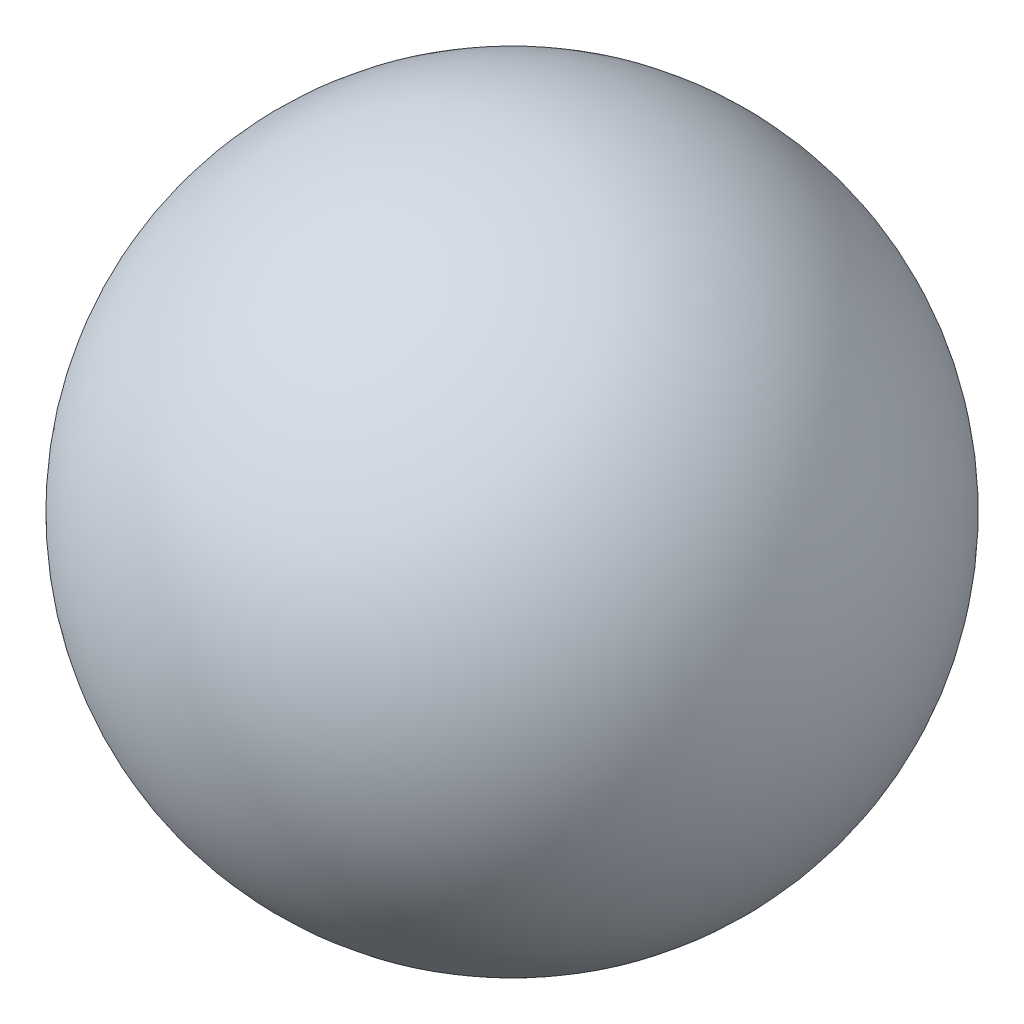
ISO-10303-21;
HEADER;
FILE_DESCRIPTION(('STEP AP214'),'2;1');
FILE_NAME('part.step','',(''),(''),'','','');
FILE_SCHEMA(('AUTOMOTIVE_DESIGN { 1 0 10303 214 1 1 1 1 }'));
ENDSEC;
DATA;
#1=APPLICATION_CONTEXT('core data for automotive mechanical design processes');
#2=APPLICATION_PROTOCOL_DEFINITION('international standard','automotive_design',2000,#1);
#3=PRODUCT_CONTEXT('',#1,'mechanical');
#4=PRODUCT('Part','Part','',(#3));
#5=PRODUCT_RELATED_PRODUCT_CATEGORY('part','',(#4));
#6=PRODUCT_DEFINITION_FORMATION('','',#4);
#7=PRODUCT_DEFINITION_CONTEXT('part definition',#1,'design');
#8=PRODUCT_DEFINITION('design','',#6,#7);
#9=PRODUCT_DEFINITION_SHAPE('','',#8);
#10=(LENGTH_UNIT() NAMED_UNIT(*) SI_UNIT(.MILLI.,.METRE.));
#11=(NAMED_UNIT(*) PLANE_ANGLE_UNIT() SI_UNIT($,.RADIAN.));
#12=(NAMED_UNIT(*) SI_UNIT($,.STERADIAN.) SOLID_ANGLE_UNIT());
#13=UNCERTAINTY_MEASURE_WITH_UNIT(LENGTH_MEASURE(1.E-05),#10,'distance_accuracy_value','');
#14=(GEOMETRIC_REPRESENTATION_CONTEXT(3) GLOBAL_UNCERTAINTY_ASSIGNED_CONTEXT((#13)) GLOBAL_UNIT_ASSIGNED_CONTEXT((#10,
#11,#12)) REPRESENTATION_CONTEXT('',''));
#15=CARTESIAN_POINT('',(0.,0.,0.));
#16=DIRECTION('',(0.,0.,1.));
#17=DIRECTION('',(1.,0.,0.));
#18=AXIS2_PLACEMENT_3D('',#15,#16,#17);
#19=CARTESIAN_POINT('',(0.,0.,0.));
#20=DIRECTION('',(0.,1.,0.));
#21=DIRECTION('',(1.,0.,0.));
#22=AXIS2_PLACEMENT_3D('',#19,#20,#21);
#23=SPHERICAL_SURFACE('',#22,115.);
#24=CARTESIAN_POINT('',(0.,115.,0.));
#25=VERTEX_POINT('',#24);
#26=VERTEX_LOOP('',#25);
#27=FACE_BOUND('',#26,.T.);
#28=ADVANCED_FACE('F33',(#27),#23,.T.);
#29=CLOSED_SHELL('',(#28));
#30=MANIFOLD_SOLID_BREP('B2',#29);
#31=ADVANCED_BREP_SHAPE_REPRESENTATION('',(#18,#30),#14);
#32=SHAPE_DEFINITION_REPRESENTATION(#9,#31);
ENDSEC;
END-ISO-10303-21;
